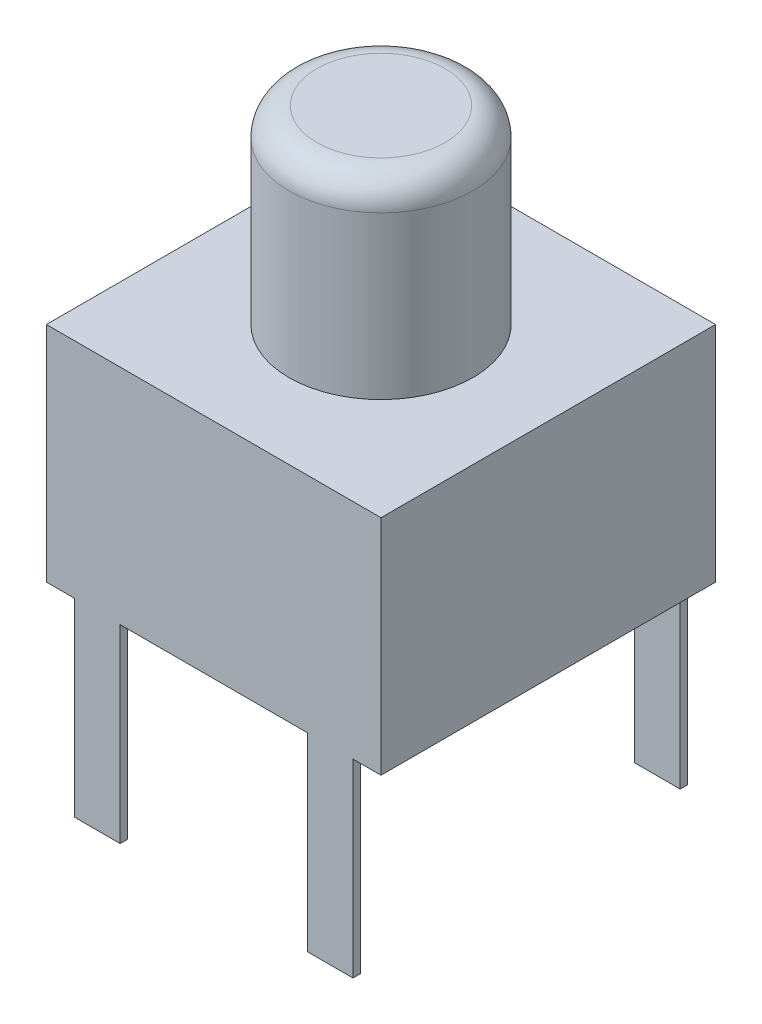
ISO-10303-21;
HEADER;
FILE_DESCRIPTION(('STEP AP214'),'2;1');
FILE_NAME('part.step','',(''),(''),'','','');
FILE_SCHEMA(('AUTOMOTIVE_DESIGN { 1 0 10303 214 1 1 1 1 }'));
ENDSEC;
DATA;
#1=APPLICATION_CONTEXT('core data for automotive mechanical design processes');
#2=APPLICATION_PROTOCOL_DEFINITION('international standard','automotive_design',2000,#1);
#3=PRODUCT_CONTEXT('',#1,'mechanical');
#4=PRODUCT('Part','Part','',(#3));
#5=PRODUCT_RELATED_PRODUCT_CATEGORY('part','',(#4));
#6=PRODUCT_DEFINITION_FORMATION('','',#4);
#7=PRODUCT_DEFINITION_CONTEXT('part definition',#1,'design');
#8=PRODUCT_DEFINITION('design','',#6,#7);
#9=PRODUCT_DEFINITION_SHAPE('','',#8);
#10=(LENGTH_UNIT() NAMED_UNIT(*) SI_UNIT(.MILLI.,.METRE.));
#11=(NAMED_UNIT(*) PLANE_ANGLE_UNIT() SI_UNIT($,.RADIAN.));
#12=(NAMED_UNIT(*) SI_UNIT($,.STERADIAN.) SOLID_ANGLE_UNIT());
#13=UNCERTAINTY_MEASURE_WITH_UNIT(LENGTH_MEASURE(1.E-05),#10,'distance_accuracy_value','');
#14=(GEOMETRIC_REPRESENTATION_CONTEXT(3) GLOBAL_UNCERTAINTY_ASSIGNED_CONTEXT((#13)) GLOBAL_UNIT_ASSIGNED_CONTEXT((#10,
#11,#12)) REPRESENTATION_CONTEXT('',''));
#15=CARTESIAN_POINT('',(0.,0.,0.));
#16=DIRECTION('',(0.,0.,1.));
#17=DIRECTION('',(1.,0.,0.));
#18=AXIS2_PLACEMENT_3D('',#15,#16,#17);
#19=CARTESIAN_POINT('',(0.,0.,0.));
#20=DIRECTION('',(0.,1.,0.));
#21=DIRECTION('',(0.,0.,1.));
#22=AXIS2_PLACEMENT_3D('',#19,#20,#21);
#23=PLANE('',#22);
#24=DIRECTION('',(0.,0.,1.));
#25=VECTOR('',#24,1.);
#26=CARTESIAN_POINT('',(2.49760624437562,0.,3.));
#27=LINE('',#26,#25);
#28=CARTESIAN_POINT('',(2.49760624437562,0.,2.86740280237159));
#29=VERTEX_POINT('',#28);
#30=CARTESIAN_POINT('',(2.49760624437562,0.,3.));
#31=VERTEX_POINT('',#30);
#32=EDGE_CURVE('E57',#29,#31,#27,.T.);
#33=ORIENTED_EDGE('',*,*,#32,.F.);
#34=DIRECTION('',(1.,0.,0.));
#35=VECTOR('',#34,1.);
#36=CARTESIAN_POINT('',(2.49760624437562,0.,2.86740280237159));
#37=LINE('',#36,#35);
#38=CARTESIAN_POINT('',(1.67763740188249,0.,2.86740280237159));
#39=VERTEX_POINT('',#38);
#40=EDGE_CURVE('E200',#39,#29,#37,.T.);
#41=ORIENTED_EDGE('',*,*,#40,.F.);
#42=DIRECTION('',(0.,0.,-1.));
#43=VECTOR('',#42,1.);
#44=CARTESIAN_POINT('',(1.67763740188249,0.,3.));
#45=LINE('',#44,#43);
#46=CARTESIAN_POINT('',(1.67763740188249,0.,3.));
#47=VERTEX_POINT('',#46);
#48=EDGE_CURVE('E694',#47,#39,#45,.T.);
#49=ORIENTED_EDGE('',*,*,#48,.F.);
#50=DIRECTION('',(1.,0.,0.));
#51=VECTOR('',#50,1.);
#52=CARTESIAN_POINT('',(-3.,0.,3.));
#53=LINE('',#52,#51);
#54=CARTESIAN_POINT('',(-1.67763740188249,0.,3.));
#55=VERTEX_POINT('',#54);
#56=EDGE_CURVE('E366',#55,#47,#53,.T.);
#57=ORIENTED_EDGE('',*,*,#56,.F.);
#58=DIRECTION('',(0.,0.,-1.));
#59=VECTOR('',#58,1.);
#60=CARTESIAN_POINT('',(-1.67763740188249,0.,3.));
#61=LINE('',#60,#59);
#62=CARTESIAN_POINT('',(-1.67763740188249,0.,2.86740280237159));
#63=VERTEX_POINT('',#62);
#64=EDGE_CURVE('E254',#55,#63,#61,.T.);
#65=ORIENTED_EDGE('',*,*,#64,.T.);
#66=DIRECTION('',(-1.,0.,0.));
#67=VECTOR('',#66,1.);
#68=CARTESIAN_POINT('',(-2.49760624437562,0.,2.86740280237159));
#69=LINE('',#68,#67);
#70=CARTESIAN_POINT('',(-2.49760624437562,0.,2.86740280237159));
#71=VERTEX_POINT('',#70);
#72=EDGE_CURVE('E270',#63,#71,#69,.T.);
#73=ORIENTED_EDGE('',*,*,#72,.T.);
#74=DIRECTION('',(0.,0.,1.));
#75=VECTOR('',#74,1.);
#76=CARTESIAN_POINT('',(-2.49760624437562,0.,3.));
#77=LINE('',#76,#75);
#78=CARTESIAN_POINT('',(-2.49760624437562,0.,3.));
#79=VERTEX_POINT('',#78);
#80=EDGE_CURVE('E248',#71,#79,#77,.T.);
#81=ORIENTED_EDGE('',*,*,#80,.T.);
#82=CARTESIAN_POINT('',(-3.,0.,3.));
#83=VERTEX_POINT('',#82);
#84=EDGE_CURVE('E341',#83,#79,#53,.T.);
#85=ORIENTED_EDGE('',*,*,#84,.F.);
#86=DIRECTION('',(0.,0.,1.));
#87=VECTOR('',#86,1.);
#88=CARTESIAN_POINT('',(-3.,0.,-3.));
#89=LINE('',#88,#87);
#90=CARTESIAN_POINT('',(-3.,0.,-3.));
#91=VERTEX_POINT('',#90);
#92=EDGE_CURVE('E359',#91,#83,#89,.T.);
#93=ORIENTED_EDGE('',*,*,#92,.F.);
#94=DIRECTION('',(-1.,0.,0.));
#95=VECTOR('',#94,1.);
#96=CARTESIAN_POINT('',(-3.,0.,-3.));
#97=LINE('',#96,#95);
#98=CARTESIAN_POINT('',(-2.49760624437562,0.,-3.));
#99=VERTEX_POINT('',#98);
#100=EDGE_CURVE('E354',#99,#91,#97,.T.);
#101=ORIENTED_EDGE('',*,*,#100,.F.);
#102=DIRECTION('',(0.,0.,-1.));
#103=VECTOR('',#102,1.);
#104=CARTESIAN_POINT('',(-2.49760624437562,0.,-3.));
#105=LINE('',#104,#103);
#106=CARTESIAN_POINT('',(-2.49760624437562,0.,-2.86740280237159));
#107=VERTEX_POINT('',#106);
#108=EDGE_CURVE('E289',#107,#99,#105,.T.);
#109=ORIENTED_EDGE('',*,*,#108,.F.);
#110=DIRECTION('',(-1.,0.,0.));
#111=VECTOR('',#110,1.);
#112=CARTESIAN_POINT('',(-2.49760624437562,0.,-2.86740280237159));
#113=LINE('',#112,#111);
#114=CARTESIAN_POINT('',(-1.67763740188249,0.,-2.86740280237159));
#115=VERTEX_POINT('',#114);
#116=EDGE_CURVE('E295',#115,#107,#113,.T.);
#117=ORIENTED_EDGE('',*,*,#116,.F.);
#118=DIRECTION('',(0.,0.,1.));
#119=VECTOR('',#118,1.);
#120=CARTESIAN_POINT('',(-1.67763740188249,0.,-3.));
#121=LINE('',#120,#119);
#122=CARTESIAN_POINT('',(-1.67763740188249,0.,-3.));
#123=VERTEX_POINT('',#122);
#124=EDGE_CURVE('E308',#123,#115,#121,.T.);
#125=ORIENTED_EDGE('',*,*,#124,.F.);
#126=CARTESIAN_POINT('',(1.67763740188249,0.,-3.));
#127=VERTEX_POINT('',#126);
#128=EDGE_CURVE('E360',#127,#123,#97,.T.);
#129=ORIENTED_EDGE('',*,*,#128,.F.);
#130=DIRECTION('',(0.,0.,1.));
#131=VECTOR('',#130,1.);
#132=CARTESIAN_POINT('',(1.67763740188249,0.,-3.));
#133=LINE('',#132,#131);
#134=CARTESIAN_POINT('',(1.67763740188249,0.,-2.86740280237159));
#135=VERTEX_POINT('',#134);
#136=EDGE_CURVE('E65',#127,#135,#133,.T.);
#137=ORIENTED_EDGE('',*,*,#136,.T.);
#138=DIRECTION('',(1.,0.,0.));
#139=VECTOR('',#138,1.);
#140=CARTESIAN_POINT('',(2.49760624437562,0.,-2.86740280237159));
#141=LINE('',#140,#139);
#142=CARTESIAN_POINT('',(2.49760624437562,0.,-2.86740280237159));
#143=VERTEX_POINT('',#142);
#144=EDGE_CURVE('E209',#135,#143,#141,.T.);
#145=ORIENTED_EDGE('',*,*,#144,.T.);
#146=DIRECTION('',(0.,0.,-1.));
#147=VECTOR('',#146,1.);
#148=CARTESIAN_POINT('',(2.49760624437562,0.,-3.));
#149=LINE('',#148,#147);
#150=CARTESIAN_POINT('',(2.49760624437562,0.,-3.));
#151=VERTEX_POINT('',#150);
#152=EDGE_CURVE('E204',#143,#151,#149,.T.);
#153=ORIENTED_EDGE('',*,*,#152,.T.);
#154=CARTESIAN_POINT('',(3.,0.,-3.));
#155=VERTEX_POINT('',#154);
#156=EDGE_CURVE('E355',#155,#151,#97,.T.);
#157=ORIENTED_EDGE('',*,*,#156,.F.);
#158=DIRECTION('',(0.,0.,-1.));
#159=VECTOR('',#158,1.);
#160=CARTESIAN_POINT('',(3.,0.,-3.));
#161=LINE('',#160,#159);
#162=CARTESIAN_POINT('',(3.,0.,3.));
#163=VERTEX_POINT('',#162);
#164=EDGE_CURVE('E330',#163,#155,#161,.T.);
#165=ORIENTED_EDGE('',*,*,#164,.F.);
#166=EDGE_CURVE('E363',#31,#163,#53,.T.);
#167=ORIENTED_EDGE('',*,*,#166,.F.);
#168=EDGE_LOOP('',(#33,#41,#49,#57,#65,#73,#81,#85,#93,#101,#109,#117,#125,#129,#137,#145,#153,
#157,#165,#167));
#169=FACE_BOUND('',#168,.T.);
#170=ADVANCED_FACE('F41',(#169),#23,.F.);
#171=CARTESIAN_POINT('',(3.,4.,-3.));
#172=DIRECTION('',(-1.,0.,0.));
#173=DIRECTION('',(0.,0.,1.));
#174=AXIS2_PLACEMENT_3D('',#171,#172,#173);
#175=PLANE('',#174);
#176=ORIENTED_EDGE('',*,*,#164,.T.);
#177=DIRECTION('',(0.,-1.,0.));
#178=VECTOR('',#177,1.);
#179=CARTESIAN_POINT('',(3.,4.,-3.));
#180=LINE('',#179,#178);
#181=CARTESIAN_POINT('',(3.,4.,-3.));
#182=VERTEX_POINT('',#181);
#183=EDGE_CURVE('E335',#182,#155,#180,.T.);
#184=ORIENTED_EDGE('',*,*,#183,.F.);
#185=DIRECTION('',(0.,0.,-1.));
#186=VECTOR('',#185,1.);
#187=CARTESIAN_POINT('',(3.,4.,-3.));
#188=LINE('',#187,#186);
#189=CARTESIAN_POINT('',(3.,4.,3.));
#190=VERTEX_POINT('',#189);
#191=EDGE_CURVE('E336',#190,#182,#188,.T.);
#192=ORIENTED_EDGE('',*,*,#191,.F.);
#193=DIRECTION('',(0.,-1.,0.));
#194=VECTOR('',#193,1.);
#195=CARTESIAN_POINT('',(3.,4.,3.));
#196=LINE('',#195,#194);
#197=EDGE_CURVE('E350',#190,#163,#196,.T.);
#198=ORIENTED_EDGE('',*,*,#197,.T.);
#199=EDGE_LOOP('',(#176,#184,#192,#198));
#200=FACE_BOUND('',#199,.T.);
#201=ADVANCED_FACE('F400',(#200),#175,.F.);
#202=CARTESIAN_POINT('',(-3.,4.,-3.));
#203=DIRECTION('',(0.,0.,1.));
#204=DIRECTION('',(1.,0.,0.));
#205=AXIS2_PLACEMENT_3D('',#202,#203,#204);
#206=PLANE('',#205);
#207=ORIENTED_EDGE('',*,*,#156,.T.);
#208=DIRECTION('',(0.,1.,0.));
#209=VECTOR('',#208,1.);
#210=CARTESIAN_POINT('',(2.49760624437562,-3.4,-3.));
#211=LINE('',#210,#209);
#212=CARTESIAN_POINT('',(2.49760624437562,-3.4,-3.));
#213=VERTEX_POINT('',#212);
#214=EDGE_CURVE('E230',#213,#151,#211,.T.);
#215=ORIENTED_EDGE('',*,*,#214,.F.);
#216=DIRECTION('',(-1.,0.,0.));
#217=VECTOR('',#216,1.);
#218=CARTESIAN_POINT('',(2.49760624437562,-3.4,-3.));
#219=LINE('',#218,#217);
#220=CARTESIAN_POINT('',(1.67763740188249,-3.4,-3.));
#221=VERTEX_POINT('',#220);
#222=EDGE_CURVE('E227',#213,#221,#219,.T.);
#223=ORIENTED_EDGE('',*,*,#222,.T.);
#224=DIRECTION('',(0.,1.,0.));
#225=VECTOR('',#224,1.);
#226=CARTESIAN_POINT('',(1.67763740188249,-3.4,-3.));
#227=LINE('',#226,#225);
#228=EDGE_CURVE('E239',#221,#127,#227,.T.);
#229=ORIENTED_EDGE('',*,*,#228,.T.);
#230=ORIENTED_EDGE('',*,*,#128,.T.);
#231=DIRECTION('',(0.,1.,0.));
#232=VECTOR('',#231,1.);
#233=CARTESIAN_POINT('',(-1.67763740188249,-3.4,-3.));
#234=LINE('',#233,#232);
#235=CARTESIAN_POINT('',(-1.67763740188249,-3.4,-3.));
#236=VERTEX_POINT('',#235);
#237=EDGE_CURVE('E322',#236,#123,#234,.T.);
#238=ORIENTED_EDGE('',*,*,#237,.F.);
#239=DIRECTION('',(1.,0.,0.));
#240=VECTOR('',#239,1.);
#241=CARTESIAN_POINT('',(-2.49760624437562,-3.4,-3.));
#242=LINE('',#241,#240);
#243=CARTESIAN_POINT('',(-2.49760624437562,-3.4,-3.));
#244=VERTEX_POINT('',#243);
#245=EDGE_CURVE('E294',#244,#236,#242,.T.);
#246=ORIENTED_EDGE('',*,*,#245,.F.);
#247=DIRECTION('',(0.,1.,0.));
#248=VECTOR('',#247,1.);
#249=CARTESIAN_POINT('',(-2.49760624437562,-3.4,-3.));
#250=LINE('',#249,#248);
#251=EDGE_CURVE('E326',#244,#99,#250,.T.);
#252=ORIENTED_EDGE('',*,*,#251,.T.);
#253=ORIENTED_EDGE('',*,*,#100,.T.);
#254=DIRECTION('',(0.,-1.,0.));
#255=VECTOR('',#254,1.);
#256=CARTESIAN_POINT('',(-3.,4.,-3.));
#257=LINE('',#256,#255);
#258=CARTESIAN_POINT('',(-3.,4.,-3.));
#259=VERTEX_POINT('',#258);
#260=EDGE_CURVE('E374',#259,#91,#257,.T.);
#261=ORIENTED_EDGE('',*,*,#260,.F.);
#262=DIRECTION('',(-1.,0.,0.));
#263=VECTOR('',#262,1.);
#264=CARTESIAN_POINT('',(-3.,4.,-3.));
#265=LINE('',#264,#263);
#266=EDGE_CURVE('E340',#182,#259,#265,.T.);
#267=ORIENTED_EDGE('',*,*,#266,.F.);
#268=ORIENTED_EDGE('',*,*,#183,.T.);
#269=EDGE_LOOP('',(#207,#215,#223,#229,#230,#238,#246,#252,#253,#261,#267,#268));
#270=FACE_BOUND('',#269,.T.);
#271=ADVANCED_FACE('F406',(#270),#206,.F.);
#272=CARTESIAN_POINT('',(-3.,4.,-3.));
#273=DIRECTION('',(1.,0.,0.));
#274=DIRECTION('',(0.,0.,-1.));
#275=AXIS2_PLACEMENT_3D('',#272,#273,#274);
#276=PLANE('',#275);
#277=ORIENTED_EDGE('',*,*,#92,.T.);
#278=DIRECTION('',(0.,-1.,0.));
#279=VECTOR('',#278,1.);
#280=CARTESIAN_POINT('',(-3.,4.,3.));
#281=LINE('',#280,#279);
#282=CARTESIAN_POINT('',(-3.,4.,3.));
#283=VERTEX_POINT('',#282);
#284=EDGE_CURVE('E370',#283,#83,#281,.T.);
#285=ORIENTED_EDGE('',*,*,#284,.F.);
#286=DIRECTION('',(0.,0.,1.));
#287=VECTOR('',#286,1.);
#288=CARTESIAN_POINT('',(-3.,4.,-3.));
#289=LINE('',#288,#287);
#290=EDGE_CURVE('E344',#259,#283,#289,.T.);
#291=ORIENTED_EDGE('',*,*,#290,.F.);
#292=ORIENTED_EDGE('',*,*,#260,.T.);
#293=EDGE_LOOP('',(#277,#285,#291,#292));
#294=FACE_BOUND('',#293,.T.);
#295=ADVANCED_FACE('F414',(#294),#276,.F.);
#296=CARTESIAN_POINT('',(-3.,4.,3.));
#297=DIRECTION('',(0.,0.,-1.));
#298=DIRECTION('',(-1.,0.,0.));
#299=AXIS2_PLACEMENT_3D('',#296,#297,#298);
#300=PLANE('',#299);
#301=ORIENTED_EDGE('',*,*,#84,.T.);
#302=DIRECTION('',(0.,1.,0.));
#303=VECTOR('',#302,1.);
#304=CARTESIAN_POINT('',(-2.49760624437562,-3.4,3.));
#305=LINE('',#304,#303);
#306=CARTESIAN_POINT('',(-2.49760624437562,-3.4,3.));
#307=VERTEX_POINT('',#306);
#308=EDGE_CURVE('E266',#307,#79,#305,.T.);
#309=ORIENTED_EDGE('',*,*,#308,.F.);
#310=DIRECTION('',(1.,0.,0.));
#311=VECTOR('',#310,1.);
#312=CARTESIAN_POINT('',(-2.49760624437562,-3.4,3.));
#313=LINE('',#312,#311);
#314=CARTESIAN_POINT('',(-1.67763740188249,-3.4,3.));
#315=VERTEX_POINT('',#314);
#316=EDGE_CURVE('E262',#307,#315,#313,.T.);
#317=ORIENTED_EDGE('',*,*,#316,.T.);
#318=DIRECTION('',(0.,1.,0.));
#319=VECTOR('',#318,1.);
#320=CARTESIAN_POINT('',(-1.67763740188249,-3.4,3.));
#321=LINE('',#320,#319);
#322=EDGE_CURVE('E279',#315,#55,#321,.T.);
#323=ORIENTED_EDGE('',*,*,#322,.T.);
#324=ORIENTED_EDGE('',*,*,#56,.T.);
#325=DIRECTION('',(0.,1.,0.));
#326=VECTOR('',#325,1.);
#327=CARTESIAN_POINT('',(1.67763740188249,-3.4,3.));
#328=LINE('',#327,#326);
#329=CARTESIAN_POINT('',(1.67763740188249,-3.4,3.));
#330=VERTEX_POINT('',#329);
#331=EDGE_CURVE('E187',#330,#47,#328,.T.);
#332=ORIENTED_EDGE('',*,*,#331,.F.);
#333=DIRECTION('',(-1.,0.,0.));
#334=VECTOR('',#333,1.);
#335=CARTESIAN_POINT('',(2.49760624437562,-3.4,3.));
#336=LINE('',#335,#334);
#337=CARTESIAN_POINT('',(2.49760624437562,-3.4,3.));
#338=VERTEX_POINT('',#337);
#339=EDGE_CURVE('E180',#338,#330,#336,.T.);
#340=ORIENTED_EDGE('',*,*,#339,.F.);
#341=DIRECTION('',(0.,1.,0.));
#342=VECTOR('',#341,1.);
#343=CARTESIAN_POINT('',(2.49760624437562,-3.4,3.));
#344=LINE('',#343,#342);
#345=EDGE_CURVE('E184',#338,#31,#344,.T.);
#346=ORIENTED_EDGE('',*,*,#345,.T.);
#347=ORIENTED_EDGE('',*,*,#166,.T.);
#348=ORIENTED_EDGE('',*,*,#197,.F.);
#349=DIRECTION('',(1.,0.,0.));
#350=VECTOR('',#349,1.);
#351=CARTESIAN_POINT('',(-3.,4.,3.));
#352=LINE('',#351,#350);
#353=EDGE_CURVE('E347',#283,#190,#352,.T.);
#354=ORIENTED_EDGE('',*,*,#353,.F.);
#355=ORIENTED_EDGE('',*,*,#284,.T.);
#356=EDGE_LOOP('',(#301,#309,#317,#323,#324,#332,#340,#346,#347,#348,#354,#355));
#357=FACE_BOUND('',#356,.T.);
#358=ADVANCED_FACE('F183',(#357),#300,.F.);
#359=CARTESIAN_POINT('',(0.,4.,0.));
#360=DIRECTION('',(0.,1.,0.));
#361=DIRECTION('',(0.,0.,1.));
#362=AXIS2_PLACEMENT_3D('',#359,#360,#361);
#363=PLANE('',#362);
#364=CARTESIAN_POINT('',(0.,4.,0.));
#365=DIRECTION('',(0.,1.,0.));
#366=DIRECTION('',(0.,0.,1.));
#367=AXIS2_PLACEMENT_3D('',#364,#365,#366);
#368=CIRCLE('',#367,1.65);
#369=CARTESIAN_POINT('',(0.,4.,1.65));
#370=VERTEX_POINT('',#369);
#371=EDGE_CURVE('E331',#370,#370,#368,.T.);
#372=ORIENTED_EDGE('',*,*,#371,.F.);
#373=EDGE_LOOP('',(#372));
#374=FACE_BOUND('',#373,.T.);
#375=ORIENTED_EDGE('',*,*,#191,.T.);
#376=ORIENTED_EDGE('',*,*,#266,.T.);
#377=ORIENTED_EDGE('',*,*,#290,.T.);
#378=ORIENTED_EDGE('',*,*,#353,.T.);
#379=EDGE_LOOP('',(#375,#376,#377,#378));
#380=FACE_BOUND('',#379,.T.);
#381=ADVANCED_FACE('F410',(#374,#380),#363,.T.);
#382=CARTESIAN_POINT('',(0.,7.4,0.));
#383=DIRECTION('',(0.,-1.,0.));
#384=DIRECTION('',(0.,0.,-1.));
#385=AXIS2_PLACEMENT_3D('',#382,#383,#384);
#386=CYLINDRICAL_SURFACE('',#385,1.65);
#387=CARTESIAN_POINT('',(0.,6.9,0.));
#388=DIRECTION('',(0.,1.,0.));
#389=DIRECTION('',(0.,0.,1.));
#390=AXIS2_PLACEMENT_3D('',#387,#388,#389);
#391=CIRCLE('',#390,1.65);
#392=CARTESIAN_POINT('',(0.,6.9,1.65));
#393=VERTEX_POINT('',#392);
#394=EDGE_CURVE('E11',#393,#393,#391,.F.);
#395=ORIENTED_EDGE('',*,*,#394,.T.);
#396=EDGE_LOOP('',(#395));
#397=FACE_BOUND('',#396,.T.);
#398=ORIENTED_EDGE('',*,*,#371,.T.);
#399=EDGE_LOOP('',(#398));
#400=FACE_BOUND('',#399,.T.);
#401=ADVANCED_FACE('F396',(#397,#400),#386,.T.);
#402=CARTESIAN_POINT('',(0.,7.4,0.));
#403=DIRECTION('',(0.,1.,0.));
#404=DIRECTION('',(0.,0.,1.));
#405=AXIS2_PLACEMENT_3D('',#402,#403,#404);
#406=PLANE('',#405);
#407=CARTESIAN_POINT('',(0.,7.4,0.));
#408=DIRECTION('',(0.,1.,0.));
#409=DIRECTION('',(0.,0.,1.));
#410=AXIS2_PLACEMENT_3D('',#407,#408,#409);
#411=CIRCLE('',#410,1.15);
#412=CARTESIAN_POINT('',(0.,7.4,1.15));
#413=VERTEX_POINT('',#412);
#414=EDGE_CURVE('E50',#413,#413,#411,.T.);
#415=ORIENTED_EDGE('',*,*,#414,.T.);
#416=EDGE_LOOP('',(#415));
#417=FACE_BOUND('',#416,.T.);
#418=ADVANCED_FACE('F384',(#417),#406,.T.);
#419=CARTESIAN_POINT('',(0.,6.9,0.));
#420=DIRECTION('',(0.,1.,0.));
#421=DIRECTION('',(0.,0.,1.));
#422=AXIS2_PLACEMENT_3D('',#419,#420,#421);
#423=TOROIDAL_SURFACE('',#422,1.15,0.5);
#424=ORIENTED_EDGE('',*,*,#394,.F.);
#425=EDGE_LOOP('',(#424));
#426=FACE_BOUND('',#425,.T.);
#427=ORIENTED_EDGE('',*,*,#414,.F.);
#428=EDGE_LOOP('',(#427));
#429=FACE_BOUND('',#428,.T.);
#430=ADVANCED_FACE('F43',(#426,#429),#423,.T.);
#431=CARTESIAN_POINT('',(-2.49760624437562,-3.4,-3.));
#432=DIRECTION('',(1.,0.,0.));
#433=DIRECTION('',(0.,0.,-1.));
#434=AXIS2_PLACEMENT_3D('',#431,#432,#433);
#435=PLANE('',#434);
#436=ORIENTED_EDGE('',*,*,#108,.T.);
#437=ORIENTED_EDGE('',*,*,#251,.F.);
#438=DIRECTION('',(0.,0.,-1.));
#439=VECTOR('',#438,1.);
#440=CARTESIAN_POINT('',(-2.49760624437562,-3.4,-3.));
#441=LINE('',#440,#439);
#442=CARTESIAN_POINT('',(-2.49760624437562,-3.4,-2.86740280237159));
#443=VERTEX_POINT('',#442);
#444=EDGE_CURVE('E290',#443,#244,#441,.T.);
#445=ORIENTED_EDGE('',*,*,#444,.F.);
#446=DIRECTION('',(0.,1.,0.));
#447=VECTOR('',#446,1.);
#448=CARTESIAN_POINT('',(-2.49760624437562,-3.4,-2.86740280237159));
#449=LINE('',#448,#447);
#450=EDGE_CURVE('E304',#443,#107,#449,.T.);
#451=ORIENTED_EDGE('',*,*,#450,.T.);
#452=EDGE_LOOP('',(#436,#437,#445,#451));
#453=FACE_BOUND('',#452,.T.);
#454=ADVANCED_FACE('F387',(#453),#435,.F.);
#455=CARTESIAN_POINT('',(-1.67763740188249,-3.4,-3.));
#456=DIRECTION('',(-1.,0.,0.));
#457=DIRECTION('',(0.,0.,1.));
#458=AXIS2_PLACEMENT_3D('',#455,#456,#457);
#459=PLANE('',#458);
#460=ORIENTED_EDGE('',*,*,#124,.T.);
#461=DIRECTION('',(0.,1.,0.));
#462=VECTOR('',#461,1.);
#463=CARTESIAN_POINT('',(-1.67763740188249,-3.4,-2.86740280237159));
#464=LINE('',#463,#462);
#465=CARTESIAN_POINT('',(-1.67763740188249,-3.4,-2.86740280237159));
#466=VERTEX_POINT('',#465);
#467=EDGE_CURVE('E318',#466,#115,#464,.T.);
#468=ORIENTED_EDGE('',*,*,#467,.F.);
#469=DIRECTION('',(0.,0.,1.));
#470=VECTOR('',#469,1.);
#471=CARTESIAN_POINT('',(-1.67763740188249,-3.4,-3.));
#472=LINE('',#471,#470);
#473=EDGE_CURVE('E298',#236,#466,#472,.T.);
#474=ORIENTED_EDGE('',*,*,#473,.F.);
#475=ORIENTED_EDGE('',*,*,#237,.T.);
#476=EDGE_LOOP('',(#460,#468,#474,#475));
#477=FACE_BOUND('',#476,.T.);
#478=ADVANCED_FACE('F393',(#477),#459,.F.);
#479=CARTESIAN_POINT('',(-2.49760624437562,-3.4,-2.86740280237159));
#480=DIRECTION('',(0.,0.,-1.));
#481=DIRECTION('',(-1.,0.,0.));
#482=AXIS2_PLACEMENT_3D('',#479,#480,#481);
#483=PLANE('',#482);
#484=ORIENTED_EDGE('',*,*,#116,.T.);
#485=ORIENTED_EDGE('',*,*,#450,.F.);
#486=DIRECTION('',(-1.,0.,0.));
#487=VECTOR('',#486,1.);
#488=CARTESIAN_POINT('',(-2.49760624437562,-3.4,-2.86740280237159));
#489=LINE('',#488,#487);
#490=EDGE_CURVE('E301',#466,#443,#489,.T.);
#491=ORIENTED_EDGE('',*,*,#490,.F.);
#492=ORIENTED_EDGE('',*,*,#467,.T.);
#493=EDGE_LOOP('',(#484,#485,#491,#492));
#494=FACE_BOUND('',#493,.T.);
#495=ADVANCED_FACE('F463',(#494),#483,.F.);
#496=CARTESIAN_POINT('',(0.,-3.4,0.));
#497=DIRECTION('',(0.,1.,0.));
#498=DIRECTION('',(0.,0.,1.));
#499=AXIS2_PLACEMENT_3D('',#496,#497,#498);
#500=PLANE('',#499);
#501=ORIENTED_EDGE('',*,*,#444,.T.);
#502=ORIENTED_EDGE('',*,*,#245,.T.);
#503=ORIENTED_EDGE('',*,*,#473,.T.);
#504=ORIENTED_EDGE('',*,*,#490,.T.);
#505=EDGE_LOOP('',(#501,#502,#503,#504));
#506=FACE_BOUND('',#505,.T.);
#507=ADVANCED_FACE('F467',(#506),#500,.F.);
#508=CARTESIAN_POINT('',(-2.49760624437562,-3.4,3.));
#509=DIRECTION('',(-1.,0.,0.));
#510=DIRECTION('',(0.,0.,1.));
#511=AXIS2_PLACEMENT_3D('',#508,#509,#510);
#512=PLANE('',#511);
#513=ORIENTED_EDGE('',*,*,#80,.F.);
#514=DIRECTION('',(0.,1.,0.));
#515=VECTOR('',#514,1.);
#516=CARTESIAN_POINT('',(-2.49760624437562,-3.4,2.86740280237159));
#517=LINE('',#516,#515);
#518=CARTESIAN_POINT('',(-2.49760624437562,-3.4,2.86740280237159));
#519=VERTEX_POINT('',#518);
#520=EDGE_CURVE('E286',#519,#71,#517,.T.);
#521=ORIENTED_EDGE('',*,*,#520,.F.);
#522=DIRECTION('',(0.,0.,1.));
#523=VECTOR('',#522,1.);
#524=CARTESIAN_POINT('',(-2.49760624437562,-3.4,3.));
#525=LINE('',#524,#523);
#526=EDGE_CURVE('E249',#519,#307,#525,.T.);
#527=ORIENTED_EDGE('',*,*,#526,.T.);
#528=ORIENTED_EDGE('',*,*,#308,.T.);
#529=EDGE_LOOP('',(#513,#521,#527,#528));
#530=FACE_BOUND('',#529,.T.);
#531=ADVANCED_FACE('F471',(#530),#512,.T.);
#532=CARTESIAN_POINT('',(-2.49760624437562,-3.4,2.86740280237159));
#533=DIRECTION('',(0.,0.,-1.));
#534=DIRECTION('',(-1.,0.,0.));
#535=AXIS2_PLACEMENT_3D('',#532,#533,#534);
#536=PLANE('',#535);
#537=ORIENTED_EDGE('',*,*,#72,.F.);
#538=DIRECTION('',(0.,1.,0.));
#539=VECTOR('',#538,1.);
#540=CARTESIAN_POINT('',(-1.67763740188249,-3.4,2.86740280237159));
#541=LINE('',#540,#539);
#542=CARTESIAN_POINT('',(-1.67763740188249,-3.4,2.86740280237159));
#543=VERTEX_POINT('',#542);
#544=EDGE_CURVE('E283',#543,#63,#541,.T.);
#545=ORIENTED_EDGE('',*,*,#544,.F.);
#546=DIRECTION('',(-1.,0.,0.));
#547=VECTOR('',#546,1.);
#548=CARTESIAN_POINT('',(-2.49760624437562,-3.4,2.86740280237159));
#549=LINE('',#548,#547);
#550=EDGE_CURVE('E253',#543,#519,#549,.T.);
#551=ORIENTED_EDGE('',*,*,#550,.T.);
#552=ORIENTED_EDGE('',*,*,#520,.T.);
#553=EDGE_LOOP('',(#537,#545,#551,#552));
#554=FACE_BOUND('',#553,.T.);
#555=ADVANCED_FACE('F475',(#554),#536,.T.);
#556=CARTESIAN_POINT('',(-1.67763740188249,-3.4,3.));
#557=DIRECTION('',(1.,0.,0.));
#558=DIRECTION('',(0.,0.,-1.));
#559=AXIS2_PLACEMENT_3D('',#556,#557,#558);
#560=PLANE('',#559);
#561=ORIENTED_EDGE('',*,*,#64,.F.);
#562=ORIENTED_EDGE('',*,*,#322,.F.);
#563=DIRECTION('',(0.,0.,-1.));
#564=VECTOR('',#563,1.);
#565=CARTESIAN_POINT('',(-1.67763740188249,-3.4,3.));
#566=LINE('',#565,#564);
#567=EDGE_CURVE('E258',#315,#543,#566,.T.);
#568=ORIENTED_EDGE('',*,*,#567,.T.);
#569=ORIENTED_EDGE('',*,*,#544,.T.);
#570=EDGE_LOOP('',(#561,#562,#568,#569));
#571=FACE_BOUND('',#570,.T.);
#572=ADVANCED_FACE('F479',(#571),#560,.T.);
#573=CARTESIAN_POINT('',(0.,-3.4,0.));
#574=DIRECTION('',(0.,1.,0.));
#575=DIRECTION('',(0.,0.,-1.));
#576=AXIS2_PLACEMENT_3D('',#573,#574,#575);
#577=PLANE('',#576);
#578=ORIENTED_EDGE('',*,*,#526,.F.);
#579=ORIENTED_EDGE('',*,*,#550,.F.);
#580=ORIENTED_EDGE('',*,*,#567,.F.);
#581=ORIENTED_EDGE('',*,*,#316,.F.);
#582=EDGE_LOOP('',(#578,#579,#580,#581));
#583=FACE_BOUND('',#582,.T.);
#584=ADVANCED_FACE('F483',(#583),#577,.F.);
#585=CARTESIAN_POINT('',(2.49760624437562,-3.4,-3.));
#586=DIRECTION('',(1.,0.,0.));
#587=DIRECTION('',(0.,0.,-1.));
#588=AXIS2_PLACEMENT_3D('',#585,#586,#587);
#589=PLANE('',#588);
#590=ORIENTED_EDGE('',*,*,#152,.F.);
#591=DIRECTION('',(0.,1.,0.));
#592=VECTOR('',#591,1.);
#593=CARTESIAN_POINT('',(2.49760624437562,-3.4,-2.86740280237159));
#594=LINE('',#593,#592);
#595=CARTESIAN_POINT('',(2.49760624437562,-3.4,-2.86740280237159));
#596=VERTEX_POINT('',#595);
#597=EDGE_CURVE('E245',#596,#143,#594,.T.);
#598=ORIENTED_EDGE('',*,*,#597,.F.);
#599=DIRECTION('',(0.,0.,-1.));
#600=VECTOR('',#599,1.);
#601=CARTESIAN_POINT('',(2.49760624437562,-3.4,-3.));
#602=LINE('',#601,#600);
#603=EDGE_CURVE('E215',#596,#213,#602,.T.);
#604=ORIENTED_EDGE('',*,*,#603,.T.);
#605=ORIENTED_EDGE('',*,*,#214,.T.);
#606=EDGE_LOOP('',(#590,#598,#604,#605));
#607=FACE_BOUND('',#606,.T.);
#608=ADVANCED_FACE('F427',(#607),#589,.T.);
#609=CARTESIAN_POINT('',(2.49760624437562,-3.4,-2.86740280237159));
#610=DIRECTION('',(0.,0.,1.));
#611=DIRECTION('',(1.,0.,0.));
#612=AXIS2_PLACEMENT_3D('',#609,#610,#611);
#613=PLANE('',#612);
#614=ORIENTED_EDGE('',*,*,#144,.F.);
#615=DIRECTION('',(0.,1.,0.));
#616=VECTOR('',#615,1.);
#617=CARTESIAN_POINT('',(1.67763740188249,-3.4,-2.86740280237159));
#618=LINE('',#617,#616);
#619=CARTESIAN_POINT('',(1.67763740188249,-3.4,-2.86740280237159));
#620=VERTEX_POINT('',#619);
#621=EDGE_CURVE('E242',#620,#135,#618,.T.);
#622=ORIENTED_EDGE('',*,*,#621,.F.);
#623=DIRECTION('',(1.,0.,0.));
#624=VECTOR('',#623,1.);
#625=CARTESIAN_POINT('',(2.49760624437562,-3.4,-2.86740280237159));
#626=LINE('',#625,#624);
#627=EDGE_CURVE('E219',#620,#596,#626,.T.);
#628=ORIENTED_EDGE('',*,*,#627,.T.);
#629=ORIENTED_EDGE('',*,*,#597,.T.);
#630=EDGE_LOOP('',(#614,#622,#628,#629));
#631=FACE_BOUND('',#630,.T.);
#632=ADVANCED_FACE('F490',(#631),#613,.T.);
#633=CARTESIAN_POINT('',(1.67763740188249,-3.4,-3.));
#634=DIRECTION('',(-1.,0.,0.));
#635=DIRECTION('',(0.,0.,1.));
#636=AXIS2_PLACEMENT_3D('',#633,#634,#635);
#637=PLANE('',#636);
#638=ORIENTED_EDGE('',*,*,#136,.F.);
#639=ORIENTED_EDGE('',*,*,#228,.F.);
#640=DIRECTION('',(0.,0.,1.));
#641=VECTOR('',#640,1.);
#642=CARTESIAN_POINT('',(1.67763740188249,-3.4,-3.));
#643=LINE('',#642,#641);
#644=EDGE_CURVE('E223',#221,#620,#643,.T.);
#645=ORIENTED_EDGE('',*,*,#644,.T.);
#646=ORIENTED_EDGE('',*,*,#621,.T.);
#647=EDGE_LOOP('',(#638,#639,#645,#646));
#648=FACE_BOUND('',#647,.T.);
#649=ADVANCED_FACE('F493',(#648),#637,.T.);
#650=CARTESIAN_POINT('',(0.,-3.4,0.));
#651=DIRECTION('',(0.,1.,0.));
#652=DIRECTION('',(0.,0.,1.));
#653=AXIS2_PLACEMENT_3D('',#650,#651,#652);
#654=PLANE('',#653);
#655=ORIENTED_EDGE('',*,*,#603,.F.);
#656=ORIENTED_EDGE('',*,*,#627,.F.);
#657=ORIENTED_EDGE('',*,*,#644,.F.);
#658=ORIENTED_EDGE('',*,*,#222,.F.);
#659=EDGE_LOOP('',(#655,#656,#657,#658));
#660=FACE_BOUND('',#659,.T.);
#661=ADVANCED_FACE('F433',(#660),#654,.F.);
#662=CARTESIAN_POINT('',(2.49760624437562,-3.4,3.));
#663=DIRECTION('',(-1.,0.,0.));
#664=DIRECTION('',(0.,0.,1.));
#665=AXIS2_PLACEMENT_3D('',#662,#663,#664);
#666=PLANE('',#665);
#667=ORIENTED_EDGE('',*,*,#32,.T.);
#668=ORIENTED_EDGE('',*,*,#345,.F.);
#669=DIRECTION('',(0.,0.,1.));
#670=VECTOR('',#669,1.);
#671=CARTESIAN_POINT('',(2.49760624437562,-3.4,3.));
#672=LINE('',#671,#670);
#673=CARTESIAN_POINT('',(2.49760624437562,-3.4,2.86740280237159));
#674=VERTEX_POINT('',#673);
#675=EDGE_CURVE('E192',#674,#338,#672,.T.);
#676=ORIENTED_EDGE('',*,*,#675,.F.);
#677=DIRECTION('',(0.,1.,0.));
#678=VECTOR('',#677,1.);
#679=CARTESIAN_POINT('',(2.49760624437562,-3.4,2.86740280237159));
#680=LINE('',#679,#678);
#681=EDGE_CURVE('E690',#674,#29,#680,.T.);
#682=ORIENTED_EDGE('',*,*,#681,.T.);
#683=EDGE_LOOP('',(#667,#668,#676,#682));
#684=FACE_BOUND('',#683,.T.);
#685=ADVANCED_FACE('F202',(#684),#666,.F.);
#686=CARTESIAN_POINT('',(1.67763740188249,-3.4,3.));
#687=DIRECTION('',(1.,0.,0.));
#688=DIRECTION('',(0.,0.,-1.));
#689=AXIS2_PLACEMENT_3D('',#686,#687,#688);
#690=PLANE('',#689);
#691=ORIENTED_EDGE('',*,*,#48,.T.);
#692=DIRECTION('',(0.,1.,0.));
#693=VECTOR('',#692,1.);
#694=CARTESIAN_POINT('',(1.67763740188249,-3.4,2.86740280237159));
#695=LINE('',#694,#693);
#696=CARTESIAN_POINT('',(1.67763740188249,-3.4,2.86740280237159));
#697=VERTEX_POINT('',#696);
#698=EDGE_CURVE('E211',#697,#39,#695,.T.);
#699=ORIENTED_EDGE('',*,*,#698,.F.);
#700=DIRECTION('',(0.,0.,-1.));
#701=VECTOR('',#700,1.);
#702=CARTESIAN_POINT('',(1.67763740188249,-3.4,3.));
#703=LINE('',#702,#701);
#704=EDGE_CURVE('E191',#330,#697,#703,.T.);
#705=ORIENTED_EDGE('',*,*,#704,.F.);
#706=ORIENTED_EDGE('',*,*,#331,.T.);
#707=EDGE_LOOP('',(#691,#699,#705,#706));
#708=FACE_BOUND('',#707,.T.);
#709=ADVANCED_FACE('F501',(#708),#690,.F.);
#710=CARTESIAN_POINT('',(2.49760624437562,-3.4,2.86740280237159));
#711=DIRECTION('',(0.,0.,1.));
#712=DIRECTION('',(1.,0.,0.));
#713=AXIS2_PLACEMENT_3D('',#710,#711,#712);
#714=PLANE('',#713);
#715=ORIENTED_EDGE('',*,*,#40,.T.);
#716=ORIENTED_EDGE('',*,*,#681,.F.);
#717=DIRECTION('',(1.,0.,0.));
#718=VECTOR('',#717,1.);
#719=CARTESIAN_POINT('',(2.49760624437562,-3.4,2.86740280237159));
#720=LINE('',#719,#718);
#721=EDGE_CURVE('E197',#697,#674,#720,.T.);
#722=ORIENTED_EDGE('',*,*,#721,.F.);
#723=ORIENTED_EDGE('',*,*,#698,.T.);
#724=EDGE_LOOP('',(#715,#716,#722,#723));
#725=FACE_BOUND('',#724,.T.);
#726=ADVANCED_FACE('F504',(#725),#714,.F.);
#727=CARTESIAN_POINT('',(0.,-3.4,0.));
#728=DIRECTION('',(0.,1.,0.));
#729=DIRECTION('',(0.,0.,-1.));
#730=AXIS2_PLACEMENT_3D('',#727,#728,#729);
#731=PLANE('',#730);
#732=ORIENTED_EDGE('',*,*,#675,.T.);
#733=ORIENTED_EDGE('',*,*,#339,.T.);
#734=ORIENTED_EDGE('',*,*,#704,.T.);
#735=ORIENTED_EDGE('',*,*,#721,.T.);
#736=EDGE_LOOP('',(#732,#733,#734,#735));
#737=FACE_BOUND('',#736,.T.);
#738=ADVANCED_FACE('F195',(#737),#731,.F.);
#739=CLOSED_SHELL('',(#170,#201,#271,#295,#358,#381,#401,#418,#430,#454,#478,#495,#507,#531,
#555,#572,#584,#608,#632,#649,#661,#685,#709,#726,#738));
#740=MANIFOLD_SOLID_BREP('B2',#739);
#741=ADVANCED_BREP_SHAPE_REPRESENTATION('',(#18,#740),#14);
#742=SHAPE_DEFINITION_REPRESENTATION(#9,#741);
ENDSEC;
END-ISO-10303-21;
